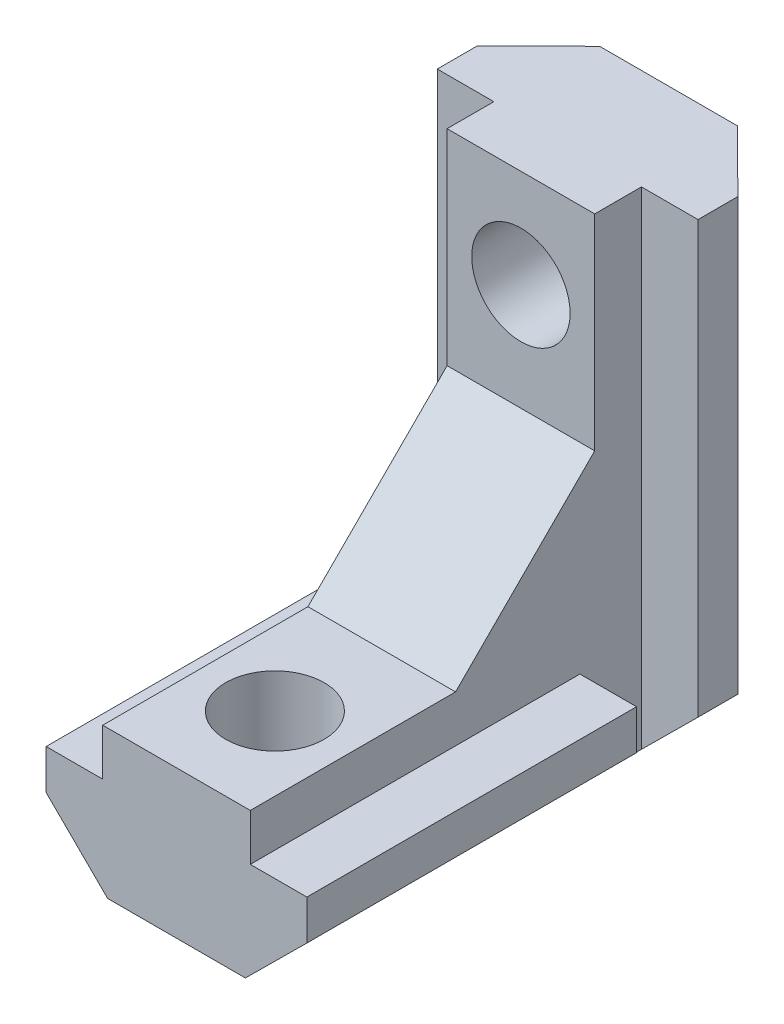
ISO-10303-21;
HEADER;
FILE_DESCRIPTION(('STEP AP214'),'2;1');
FILE_NAME('part.step','',(''),(''),'','','');
FILE_SCHEMA(('AUTOMOTIVE_DESIGN { 1 0 10303 214 1 1 1 1 }'));
ENDSEC;
DATA;
#1=APPLICATION_CONTEXT('core data for automotive mechanical design processes');
#2=APPLICATION_PROTOCOL_DEFINITION('international standard','automotive_design',2000,#1);
#3=PRODUCT_CONTEXT('',#1,'mechanical');
#4=PRODUCT('Part','Part','',(#3));
#5=PRODUCT_RELATED_PRODUCT_CATEGORY('part','',(#4));
#6=PRODUCT_DEFINITION_FORMATION('','',#4);
#7=PRODUCT_DEFINITION_CONTEXT('part definition',#1,'design');
#8=PRODUCT_DEFINITION('design','',#6,#7);
#9=PRODUCT_DEFINITION_SHAPE('','',#8);
#10=(LENGTH_UNIT() NAMED_UNIT(*) SI_UNIT(.MILLI.,.METRE.));
#11=(NAMED_UNIT(*) PLANE_ANGLE_UNIT() SI_UNIT($,.RADIAN.));
#12=(NAMED_UNIT(*) SI_UNIT($,.STERADIAN.) SOLID_ANGLE_UNIT());
#13=UNCERTAINTY_MEASURE_WITH_UNIT(LENGTH_MEASURE(1.E-05),#10,'distance_accuracy_value','');
#14=(GEOMETRIC_REPRESENTATION_CONTEXT(3) GLOBAL_UNCERTAINTY_ASSIGNED_CONTEXT((#13)) GLOBAL_UNIT_ASSIGNED_CONTEXT((#10,
#11,#12)) REPRESENTATION_CONTEXT('',''));
#15=CARTESIAN_POINT('',(0.,0.,0.));
#16=DIRECTION('',(0.,0.,1.));
#17=DIRECTION('',(1.,0.,0.));
#18=AXIS2_PLACEMENT_3D('',#15,#16,#17);
#19=CARTESIAN_POINT('',(-5.3,4.1,20.));
#20=DIRECTION('',(1.,0.,0.));
#21=DIRECTION('',(0.,0.,-1.));
#22=AXIS2_PLACEMENT_3D('',#19,#20,#21);
#23=PLANE('',#22);
#24=DIRECTION('',(0.,-1.,0.));
#25=VECTOR('',#24,1.);
#26=CARTESIAN_POINT('',(-5.3,20.,6.6));
#27=LINE('',#26,#25);
#28=CARTESIAN_POINT('',(-5.3,4.1,6.6));
#29=VERTEX_POINT('',#28);
#30=CARTESIAN_POINT('',(-5.3,2.48,6.6));
#31=VERTEX_POINT('',#30);
#32=EDGE_CURVE('E411',#29,#31,#27,.T.);
#33=ORIENTED_EDGE('',*,*,#32,.T.);
#34=DIRECTION('',(0.,0.,-1.));
#35=VECTOR('',#34,1.);
#36=CARTESIAN_POINT('',(-5.3,2.48,20.));
#37=LINE('',#36,#35);
#38=CARTESIAN_POINT('',(-5.3,2.48,20.));
#39=VERTEX_POINT('',#38);
#40=EDGE_CURVE('E234',#39,#31,#37,.T.);
#41=ORIENTED_EDGE('',*,*,#40,.F.);
#42=DIRECTION('',(0.,-1.,0.));
#43=VECTOR('',#42,1.);
#44=CARTESIAN_POINT('',(-5.3,4.1,20.));
#45=LINE('',#44,#43);
#46=CARTESIAN_POINT('',(-5.3,4.1,20.));
#47=VERTEX_POINT('',#46);
#48=EDGE_CURVE('E319',#47,#39,#45,.T.);
#49=ORIENTED_EDGE('',*,*,#48,.F.);
#50=DIRECTION('',(0.,0.,-1.));
#51=VECTOR('',#50,1.);
#52=CARTESIAN_POINT('',(-5.3,4.1,20.));
#53=LINE('',#52,#51);
#54=EDGE_CURVE('E238',#47,#29,#53,.T.);
#55=ORIENTED_EDGE('',*,*,#54,.T.);
#56=EDGE_LOOP('',(#33,#41,#49,#55));
#57=FACE_BOUND('',#56,.T.);
#58=ADVANCED_FACE('F43',(#57),#23,.F.);
#59=CARTESIAN_POINT('',(-5.3,2.48,4.1));
#60=VERTEX_POINT('',#59);
#61=CARTESIAN_POINT('',(-5.3,2.48,2.48));
#62=VERTEX_POINT('',#61);
#63=EDGE_CURVE('E233',#60,#62,#37,.T.);
#64=ORIENTED_EDGE('',*,*,#63,.F.);
#65=DIRECTION('',(0.,-1.,0.));
#66=VECTOR('',#65,1.);
#67=CARTESIAN_POINT('',(-5.3,20.,4.1));
#68=LINE('',#67,#66);
#69=CARTESIAN_POINT('',(-5.3,20.,4.1));
#70=VERTEX_POINT('',#69);
#71=EDGE_CURVE('E60',#70,#60,#68,.T.);
#72=ORIENTED_EDGE('',*,*,#71,.F.);
#73=DIRECTION('',(0.,0.,1.));
#74=VECTOR('',#73,1.);
#75=CARTESIAN_POINT('',(-5.3,20.,4.1));
#76=LINE('',#75,#74);
#77=CARTESIAN_POINT('',(-5.3,20.,2.48));
#78=VERTEX_POINT('',#77);
#79=EDGE_CURVE('E355',#78,#70,#76,.T.);
#80=ORIENTED_EDGE('',*,*,#79,.F.);
#81=DIRECTION('',(0.,-1.,0.));
#82=VECTOR('',#81,1.);
#83=CARTESIAN_POINT('',(-5.3,20.,2.48));
#84=LINE('',#83,#82);
#85=EDGE_CURVE('E270',#78,#62,#84,.T.);
#86=ORIENTED_EDGE('',*,*,#85,.T.);
#87=EDGE_LOOP('',(#64,#72,#80,#86));
#88=FACE_BOUND('',#87,.T.);
#89=ADVANCED_FACE('F450',(#88),#23,.F.);
#90=CARTESIAN_POINT('',(5.3,4.1,20.));
#91=DIRECTION('',(-1.,0.,0.));
#92=DIRECTION('',(0.,0.,1.));
#93=AXIS2_PLACEMENT_3D('',#90,#91,#92);
#94=PLANE('',#93);
#95=DIRECTION('',(0.,-1.,0.));
#96=VECTOR('',#95,1.);
#97=CARTESIAN_POINT('',(5.3,20.,6.6));
#98=LINE('',#97,#96);
#99=CARTESIAN_POINT('',(5.3,4.1,6.6));
#100=VERTEX_POINT('',#99);
#101=CARTESIAN_POINT('',(5.3,2.48,6.6));
#102=VERTEX_POINT('',#101);
#103=EDGE_CURVE('E195',#100,#102,#98,.T.);
#104=ORIENTED_EDGE('',*,*,#103,.F.);
#105=DIRECTION('',(0.,0.,-1.));
#106=VECTOR('',#105,1.);
#107=CARTESIAN_POINT('',(5.3,4.1,20.));
#108=LINE('',#107,#106);
#109=CARTESIAN_POINT('',(5.3,4.1,20.));
#110=VERTEX_POINT('',#109);
#111=EDGE_CURVE('E206',#110,#100,#108,.T.);
#112=ORIENTED_EDGE('',*,*,#111,.F.);
#113=DIRECTION('',(0.,1.,0.));
#114=VECTOR('',#113,1.);
#115=CARTESIAN_POINT('',(5.3,4.1,20.));
#116=LINE('',#115,#114);
#117=CARTESIAN_POINT('',(5.3,2.48,20.));
#118=VERTEX_POINT('',#117);
#119=EDGE_CURVE('E305',#118,#110,#116,.T.);
#120=ORIENTED_EDGE('',*,*,#119,.F.);
#121=DIRECTION('',(0.,0.,-1.));
#122=VECTOR('',#121,1.);
#123=CARTESIAN_POINT('',(5.3,2.48,20.));
#124=LINE('',#123,#122);
#125=EDGE_CURVE('E223',#118,#102,#124,.T.);
#126=ORIENTED_EDGE('',*,*,#125,.T.);
#127=EDGE_LOOP('',(#104,#112,#120,#126));
#128=FACE_BOUND('',#127,.T.);
#129=ADVANCED_FACE('F456',(#128),#94,.F.);
#130=DIRECTION('',(0.,-1.,0.));
#131=VECTOR('',#130,1.);
#132=CARTESIAN_POINT('',(5.3,20.,4.1));
#133=LINE('',#132,#131);
#134=CARTESIAN_POINT('',(5.3,20.,4.1));
#135=VERTEX_POINT('',#134);
#136=CARTESIAN_POINT('',(5.3,2.48,4.1));
#137=VERTEX_POINT('',#136);
#138=EDGE_CURVE('E288',#135,#137,#133,.T.);
#139=ORIENTED_EDGE('',*,*,#138,.T.);
#140=CARTESIAN_POINT('',(5.3,2.48,2.48));
#141=VERTEX_POINT('',#140);
#142=EDGE_CURVE('E217',#137,#141,#124,.T.);
#143=ORIENTED_EDGE('',*,*,#142,.T.);
#144=DIRECTION('',(0.,-1.,0.));
#145=VECTOR('',#144,1.);
#146=CARTESIAN_POINT('',(5.3,20.,2.48));
#147=LINE('',#146,#145);
#148=CARTESIAN_POINT('',(5.3,20.,2.48));
#149=VERTEX_POINT('',#148);
#150=EDGE_CURVE('E326',#149,#141,#147,.T.);
#151=ORIENTED_EDGE('',*,*,#150,.F.);
#152=DIRECTION('',(0.,0.,-1.));
#153=VECTOR('',#152,1.);
#154=CARTESIAN_POINT('',(5.3,20.,4.1));
#155=LINE('',#154,#153);
#156=EDGE_CURVE('E366',#135,#149,#155,.T.);
#157=ORIENTED_EDGE('',*,*,#156,.F.);
#158=EDGE_LOOP('',(#139,#143,#151,#157));
#159=FACE_BOUND('',#158,.T.);
#160=ADVANCED_FACE('F462',(#159),#94,.F.);
#161=CARTESIAN_POINT('',(-3.,4.1,20.));
#162=DIRECTION('',(0.,-1.,0.));
#163=DIRECTION('',(0.,0.,-1.));
#164=AXIS2_PLACEMENT_3D('',#161,#162,#163);
#165=PLANE('',#164);
#166=DIRECTION('',(1.,0.,0.));
#167=VECTOR('',#166,1.);
#168=CARTESIAN_POINT('',(-3.,4.1,6.6));
#169=LINE('',#168,#167);
#170=CARTESIAN_POINT('',(-3.,4.1,6.6));
#171=VERTEX_POINT('',#170);
#172=EDGE_CURVE('E392',#29,#171,#169,.T.);
#173=ORIENTED_EDGE('',*,*,#172,.F.);
#174=ORIENTED_EDGE('',*,*,#54,.F.);
#175=DIRECTION('',(-1.,0.,0.));
#176=VECTOR('',#175,1.);
#177=CARTESIAN_POINT('',(-3.,4.1,20.));
#178=LINE('',#177,#176);
#179=CARTESIAN_POINT('',(-3.,4.1,20.));
#180=VERTEX_POINT('',#179);
#181=EDGE_CURVE('E286',#180,#47,#178,.T.);
#182=ORIENTED_EDGE('',*,*,#181,.F.);
#183=DIRECTION('',(0.,0.,-1.));
#184=VECTOR('',#183,1.);
#185=CARTESIAN_POINT('',(-3.,4.1,20.));
#186=LINE('',#185,#184);
#187=EDGE_CURVE('E242',#180,#171,#186,.T.);
#188=ORIENTED_EDGE('',*,*,#187,.T.);
#189=EDGE_LOOP('',(#173,#174,#182,#188));
#190=FACE_BOUND('',#189,.T.);
#191=ADVANCED_FACE('F460',(#190),#165,.F.);
#192=CARTESIAN_POINT('',(-2.8,0.,20.));
#193=DIRECTION('',(0.704261315504488,0.709940842242428,0.));
#194=DIRECTION('',(-0.709940842242428,0.704261315504488,0.));
#195=AXIS2_PLACEMENT_3D('',#192,#193,#194);
#196=PLANE('',#195);
#197=DIRECTION('',(-0.709940842242428,0.704261315504488,0.));
#198=VECTOR('',#197,1.);
#199=CARTESIAN_POINT('',(-2.8,0.,6.6));
#200=LINE('',#199,#198);
#201=CARTESIAN_POINT('',(-3.,0.198400000000001,6.6));
#202=VERTEX_POINT('',#201);
#203=EDGE_CURVE('E11',#202,#31,#200,.T.);
#204=ORIENTED_EDGE('',*,*,#203,.F.);
#205=DIRECTION('',(0.,0.,1.));
#206=VECTOR('',#205,1.);
#207=CARTESIAN_POINT('',(-3.,0.1984,20.));
#208=LINE('',#207,#206);
#209=CARTESIAN_POINT('',(-3.,0.198400000000004,4.1));
#210=VERTEX_POINT('',#209);
#211=EDGE_CURVE('E405',#210,#202,#208,.T.);
#212=ORIENTED_EDGE('',*,*,#211,.F.);
#213=DIRECTION('',(0.709940842242428,-0.704261315504488,0.));
#214=VECTOR('',#213,1.);
#215=CARTESIAN_POINT('',(-2.79999999999999,0.,4.1));
#216=LINE('',#215,#214);
#217=EDGE_CURVE('E208',#60,#210,#216,.T.);
#218=ORIENTED_EDGE('',*,*,#217,.F.);
#219=ORIENTED_EDGE('',*,*,#63,.T.);
#220=DIRECTION('',(0.580441809135232,-0.57579827466215,-0.575798274662151));
#221=VECTOR('',#220,1.);
#222=CARTESIAN_POINT('',(-9.48434784483688,6.63087306207818,6.63087306207819));
#223=LINE('',#222,#221);
#224=CARTESIAN_POINT('',(-2.8,0.,0.));
#225=VERTEX_POINT('',#224);
#226=EDGE_CURVE('E53',#62,#225,#223,.T.);
#227=ORIENTED_EDGE('',*,*,#226,.T.);
#228=DIRECTION('',(0.,0.,-1.));
#229=VECTOR('',#228,1.);
#230=CARTESIAN_POINT('',(-2.8,0.,20.));
#231=LINE('',#230,#229);
#232=CARTESIAN_POINT('',(-2.8,0.,20.));
#233=VERTEX_POINT('',#232);
#234=EDGE_CURVE('E230',#233,#225,#231,.T.);
#235=ORIENTED_EDGE('',*,*,#234,.F.);
#236=DIRECTION('',(0.709940842242428,-0.704261315504488,0.));
#237=VECTOR('',#236,1.);
#238=CARTESIAN_POINT('',(-2.8,0.,20.));
#239=LINE('',#238,#237);
#240=EDGE_CURVE('E316',#39,#233,#239,.T.);
#241=ORIENTED_EDGE('',*,*,#240,.F.);
#242=ORIENTED_EDGE('',*,*,#40,.T.);
#243=EDGE_LOOP('',(#204,#212,#218,#219,#227,#235,#241,#242));
#244=FACE_BOUND('',#243,.T.);
#245=ADVANCED_FACE('F253',(#244),#196,.F.);
#246=CARTESIAN_POINT('',(2.8,0.,20.));
#247=DIRECTION('',(-0.704261315504488,0.709940842242428,0.));
#248=DIRECTION('',(-0.709940842242428,-0.704261315504488,0.));
#249=AXIS2_PLACEMENT_3D('',#246,#247,#248);
#250=PLANE('',#249);
#251=DIRECTION('',(-0.709940842242428,-0.704261315504488,0.));
#252=VECTOR('',#251,1.);
#253=CARTESIAN_POINT('',(2.8,0.,6.6));
#254=LINE('',#253,#252);
#255=CARTESIAN_POINT('',(3.,0.198399999999998,6.6));
#256=VERTEX_POINT('',#255);
#257=EDGE_CURVE('E190',#102,#256,#254,.T.);
#258=ORIENTED_EDGE('',*,*,#257,.F.);
#259=ORIENTED_EDGE('',*,*,#125,.F.);
#260=DIRECTION('',(0.709940842242428,0.704261315504488,0.));
#261=VECTOR('',#260,1.);
#262=CARTESIAN_POINT('',(2.8,0.,20.));
#263=LINE('',#262,#261);
#264=CARTESIAN_POINT('',(2.8,0.,20.));
#265=VERTEX_POINT('',#264);
#266=EDGE_CURVE('E310',#265,#118,#263,.T.);
#267=ORIENTED_EDGE('',*,*,#266,.F.);
#268=DIRECTION('',(0.,0.,-1.));
#269=VECTOR('',#268,1.);
#270=CARTESIAN_POINT('',(2.8,0.,20.));
#271=LINE('',#270,#269);
#272=CARTESIAN_POINT('',(2.8,0.,0.));
#273=VERTEX_POINT('',#272);
#274=EDGE_CURVE('E227',#265,#273,#271,.T.);
#275=ORIENTED_EDGE('',*,*,#274,.T.);
#276=DIRECTION('',(0.580441809135232,0.57579827466215,0.575798274662151));
#277=VECTOR('',#276,1.);
#278=CARTESIAN_POINT('',(9.48434784483688,6.63087306207818,6.63087306207819));
#279=LINE('',#278,#277);
#280=EDGE_CURVE('E377',#273,#141,#279,.T.);
#281=ORIENTED_EDGE('',*,*,#280,.T.);
#282=ORIENTED_EDGE('',*,*,#142,.F.);
#283=DIRECTION('',(0.709940842242428,0.704261315504488,0.));
#284=VECTOR('',#283,1.);
#285=CARTESIAN_POINT('',(2.8,0.,4.1));
#286=LINE('',#285,#284);
#287=CARTESIAN_POINT('',(3.,0.198399999999998,4.1));
#288=VERTEX_POINT('',#287);
#289=EDGE_CURVE('E401',#288,#137,#286,.T.);
#290=ORIENTED_EDGE('',*,*,#289,.F.);
#291=DIRECTION('',(0.,0.,-1.));
#292=VECTOR('',#291,1.);
#293=CARTESIAN_POINT('',(3.,0.198399999999998,20.));
#294=LINE('',#293,#292);
#295=EDGE_CURVE('E408',#256,#288,#294,.T.);
#296=ORIENTED_EDGE('',*,*,#295,.F.);
#297=EDGE_LOOP('',(#258,#259,#267,#275,#281,#282,#290,#296));
#298=FACE_BOUND('',#297,.T.);
#299=ADVANCED_FACE('F468',(#298),#250,.F.);
#300=CARTESIAN_POINT('',(3.,4.1,20.));
#301=DIRECTION('',(0.,-1.,0.));
#302=DIRECTION('',(0.,0.,-1.));
#303=AXIS2_PLACEMENT_3D('',#300,#301,#302);
#304=PLANE('',#303);
#305=DIRECTION('',(1.,0.,0.));
#306=VECTOR('',#305,1.);
#307=CARTESIAN_POINT('',(3.,4.1,6.6));
#308=LINE('',#307,#306);
#309=CARTESIAN_POINT('',(3.,4.1,6.6));
#310=VERTEX_POINT('',#309);
#311=EDGE_CURVE('E187',#310,#100,#308,.T.);
#312=ORIENTED_EDGE('',*,*,#311,.F.);
#313=DIRECTION('',(0.,0.,-1.));
#314=VECTOR('',#313,1.);
#315=CARTESIAN_POINT('',(3.,4.1,20.));
#316=LINE('',#315,#314);
#317=CARTESIAN_POINT('',(3.,4.1,20.));
#318=VERTEX_POINT('',#317);
#319=EDGE_CURVE('E203',#318,#310,#316,.T.);
#320=ORIENTED_EDGE('',*,*,#319,.F.);
#321=DIRECTION('',(-1.,0.,0.));
#322=VECTOR('',#321,1.);
#323=CARTESIAN_POINT('',(3.,4.1,20.));
#324=LINE('',#323,#322);
#325=EDGE_CURVE('E303',#110,#318,#324,.T.);
#326=ORIENTED_EDGE('',*,*,#325,.F.);
#327=ORIENTED_EDGE('',*,*,#111,.T.);
#328=EDGE_LOOP('',(#312,#320,#326,#327));
#329=FACE_BOUND('',#328,.T.);
#330=ADVANCED_FACE('F201',(#329),#304,.F.);
#331=CARTESIAN_POINT('',(-3.,6.,20.));
#332=DIRECTION('',(0.,-1.,0.));
#333=DIRECTION('',(0.,0.,-1.));
#334=AXIS2_PLACEMENT_3D('',#331,#332,#333);
#335=PLANE('',#334);
#336=CARTESIAN_POINT('',(0.,6.,16.));
#337=DIRECTION('',(0.,1.,0.));
#338=DIRECTION('',(0.,0.,1.));
#339=AXIS2_PLACEMENT_3D('',#336,#337,#338);
#340=CIRCLE('',#339,2.);
#341=CARTESIAN_POINT('',(0.,6.,18.));
#342=VERTEX_POINT('',#341);
#343=EDGE_CURVE('E428',#342,#342,#340,.T.);
#344=ORIENTED_EDGE('',*,*,#343,.F.);
#345=EDGE_LOOP('',(#344));
#346=FACE_BOUND('',#345,.T.);
#347=DIRECTION('',(-1.,0.,0.));
#348=VECTOR('',#347,1.);
#349=CARTESIAN_POINT('',(3.,6.,11.6568542494924));
#350=LINE('',#349,#348);
#351=CARTESIAN_POINT('',(3.,6.,11.6568542494924));
#352=VERTEX_POINT('',#351);
#353=CARTESIAN_POINT('',(-3.,6.,11.6568542494924));
#354=VERTEX_POINT('',#353);
#355=EDGE_CURVE('E385',#352,#354,#350,.T.);
#356=ORIENTED_EDGE('',*,*,#355,.T.);
#357=DIRECTION('',(0.,0.,-1.));
#358=VECTOR('',#357,1.);
#359=CARTESIAN_POINT('',(-3.,6.,20.));
#360=LINE('',#359,#358);
#361=CARTESIAN_POINT('',(-3.,6.,20.));
#362=VERTEX_POINT('',#361);
#363=EDGE_CURVE('E219',#362,#354,#360,.T.);
#364=ORIENTED_EDGE('',*,*,#363,.F.);
#365=DIRECTION('',(-1.,0.,0.));
#366=VECTOR('',#365,1.);
#367=CARTESIAN_POINT('',(-3.,6.,20.));
#368=LINE('',#367,#366);
#369=CARTESIAN_POINT('',(3.,6.,20.));
#370=VERTEX_POINT('',#369);
#371=EDGE_CURVE('E291',#370,#362,#368,.T.);
#372=ORIENTED_EDGE('',*,*,#371,.F.);
#373=DIRECTION('',(0.,0.,-1.));
#374=VECTOR('',#373,1.);
#375=CARTESIAN_POINT('',(3.,6.,20.));
#376=LINE('',#375,#374);
#377=EDGE_CURVE('E213',#370,#352,#376,.T.);
#378=ORIENTED_EDGE('',*,*,#377,.T.);
#379=EDGE_LOOP('',(#356,#364,#372,#378));
#380=FACE_BOUND('',#379,.T.);
#381=ADVANCED_FACE('F507',(#346,#380),#335,.F.);
#382=CARTESIAN_POINT('',(3.,20.,6.));
#383=DIRECTION('',(0.,0.,-1.));
#384=DIRECTION('',(-1.,0.,0.));
#385=AXIS2_PLACEMENT_3D('',#382,#383,#384);
#386=PLANE('',#385);
#387=CARTESIAN_POINT('',(0.,16.,6.));
#388=DIRECTION('',(0.,0.,1.));
#389=DIRECTION('',(1.,0.,0.));
#390=AXIS2_PLACEMENT_3D('',#387,#388,#389);
#391=CIRCLE('',#390,2.);
#392=CARTESIAN_POINT('',(2.,16.,6.));
#393=VERTEX_POINT('',#392);
#394=EDGE_CURVE('E421',#393,#393,#391,.T.);
#395=ORIENTED_EDGE('',*,*,#394,.F.);
#396=EDGE_LOOP('',(#395));
#397=FACE_BOUND('',#396,.T.);
#398=DIRECTION('',(-1.,0.,0.));
#399=VECTOR('',#398,1.);
#400=CARTESIAN_POINT('',(3.,11.6568542494924,6.));
#401=LINE('',#400,#399);
#402=CARTESIAN_POINT('',(3.,11.6568542494924,6.));
#403=VERTEX_POINT('',#402);
#404=CARTESIAN_POINT('',(-3.,11.6568542494924,6.));
#405=VERTEX_POINT('',#404);
#406=EDGE_CURVE('E381',#403,#405,#401,.T.);
#407=ORIENTED_EDGE('',*,*,#406,.F.);
#408=DIRECTION('',(0.,-1.,0.));
#409=VECTOR('',#408,1.);
#410=CARTESIAN_POINT('',(3.,20.,6.));
#411=LINE('',#410,#409);
#412=CARTESIAN_POINT('',(3.,20.,6.));
#413=VERTEX_POINT('',#412);
#414=EDGE_CURVE('E342',#413,#403,#411,.T.);
#415=ORIENTED_EDGE('',*,*,#414,.F.);
#416=DIRECTION('',(1.,0.,0.));
#417=VECTOR('',#416,1.);
#418=CARTESIAN_POINT('',(3.,20.,6.));
#419=LINE('',#418,#417);
#420=CARTESIAN_POINT('',(-3.,20.,6.));
#421=VERTEX_POINT('',#420);
#422=EDGE_CURVE('E345',#421,#413,#419,.T.);
#423=ORIENTED_EDGE('',*,*,#422,.F.);
#424=DIRECTION('',(0.,-1.,0.));
#425=VECTOR('',#424,1.);
#426=CARTESIAN_POINT('',(-3.,20.,6.));
#427=LINE('',#426,#425);
#428=EDGE_CURVE('E339',#421,#405,#427,.T.);
#429=ORIENTED_EDGE('',*,*,#428,.T.);
#430=EDGE_LOOP('',(#407,#415,#423,#429));
#431=FACE_BOUND('',#430,.T.);
#432=ADVANCED_FACE('F509',(#397,#431),#386,.F.);
#433=CARTESIAN_POINT('',(-2.8,0.,20.));
#434=DIRECTION('',(0.,1.,0.));
#435=DIRECTION('',(0.,0.,1.));
#436=AXIS2_PLACEMENT_3D('',#433,#434,#435);
#437=PLANE('',#436);
#438=CARTESIAN_POINT('',(0.,0.,16.));
#439=DIRECTION('',(0.,1.,0.));
#440=DIRECTION('',(0.,0.,1.));
#441=AXIS2_PLACEMENT_3D('',#438,#439,#440);
#442=CIRCLE('',#441,2.);
#443=CARTESIAN_POINT('',(0.,0.,18.));
#444=VERTEX_POINT('',#443);
#445=EDGE_CURVE('E47',#444,#444,#442,.T.);
#446=ORIENTED_EDGE('',*,*,#445,.T.);
#447=EDGE_LOOP('',(#446));
#448=FACE_BOUND('',#447,.T.);
#449=DIRECTION('',(1.,0.,0.));
#450=VECTOR('',#449,1.);
#451=CARTESIAN_POINT('',(-2.8,0.,0.));
#452=LINE('',#451,#450);
#453=EDGE_CURVE('E274',#225,#273,#452,.T.);
#454=ORIENTED_EDGE('',*,*,#453,.T.);
#455=ORIENTED_EDGE('',*,*,#274,.F.);
#456=DIRECTION('',(1.,0.,0.));
#457=VECTOR('',#456,1.);
#458=CARTESIAN_POINT('',(-2.8,0.,20.));
#459=LINE('',#458,#457);
#460=EDGE_CURVE('E313',#233,#265,#459,.T.);
#461=ORIENTED_EDGE('',*,*,#460,.F.);
#462=ORIENTED_EDGE('',*,*,#234,.T.);
#463=EDGE_LOOP('',(#454,#455,#461,#462));
#464=FACE_BOUND('',#463,.T.);
#465=ADVANCED_FACE('F437',(#448,#464),#437,.F.);
#466=CARTESIAN_POINT('',(2.8,20.,0.));
#467=DIRECTION('',(-0.704261315504489,0.,0.709940842242427));
#468=DIRECTION('',(0.709940842242427,0.,0.704261315504489));
#469=AXIS2_PLACEMENT_3D('',#466,#467,#468);
#470=PLANE('',#469);
#471=ORIENTED_EDGE('',*,*,#280,.F.);
#472=DIRECTION('',(0.,-1.,0.));
#473=VECTOR('',#472,1.);
#474=CARTESIAN_POINT('',(2.8,20.,0.));
#475=LINE('',#474,#473);
#476=CARTESIAN_POINT('',(2.8,20.,0.));
#477=VERTEX_POINT('',#476);
#478=EDGE_CURVE('E269',#477,#273,#475,.T.);
#479=ORIENTED_EDGE('',*,*,#478,.F.);
#480=DIRECTION('',(-0.709940842242427,0.,-0.704261315504489));
#481=VECTOR('',#480,1.);
#482=CARTESIAN_POINT('',(2.8,20.,0.));
#483=LINE('',#482,#481);
#484=EDGE_CURVE('E363',#149,#477,#483,.T.);
#485=ORIENTED_EDGE('',*,*,#484,.F.);
#486=ORIENTED_EDGE('',*,*,#150,.T.);
#487=EDGE_LOOP('',(#471,#479,#485,#486));
#488=FACE_BOUND('',#487,.T.);
#489=ADVANCED_FACE('F492',(#488),#470,.F.);
#490=CARTESIAN_POINT('',(-2.8,20.,0.));
#491=DIRECTION('',(0.704261315504489,0.,0.709940842242427));
#492=DIRECTION('',(0.709940842242427,0.,-0.704261315504489));
#493=AXIS2_PLACEMENT_3D('',#490,#491,#492);
#494=PLANE('',#493);
#495=ORIENTED_EDGE('',*,*,#226,.F.);
#496=ORIENTED_EDGE('',*,*,#85,.F.);
#497=DIRECTION('',(-0.709940842242427,0.,0.704261315504489));
#498=VECTOR('',#497,1.);
#499=CARTESIAN_POINT('',(-2.8,20.,0.));
#500=LINE('',#499,#498);
#501=CARTESIAN_POINT('',(-2.8,20.,0.));
#502=VERTEX_POINT('',#501);
#503=EDGE_CURVE('E265',#502,#78,#500,.T.);
#504=ORIENTED_EDGE('',*,*,#503,.F.);
#505=DIRECTION('',(0.,-1.,0.));
#506=VECTOR('',#505,1.);
#507=CARTESIAN_POINT('',(-2.8,20.,0.));
#508=LINE('',#507,#506);
#509=EDGE_CURVE('E262',#502,#225,#508,.T.);
#510=ORIENTED_EDGE('',*,*,#509,.T.);
#511=EDGE_LOOP('',(#495,#496,#504,#510));
#512=FACE_BOUND('',#511,.T.);
#513=ADVANCED_FACE('F264',(#512),#494,.F.);
#514=CARTESIAN_POINT('',(-3.,6.,20.));
#515=DIRECTION('',(1.,0.,0.));
#516=DIRECTION('',(0.,0.,-1.));
#517=AXIS2_PLACEMENT_3D('',#514,#515,#516);
#518=PLANE('',#517);
#519=DIRECTION('',(0.,-1.,0.));
#520=VECTOR('',#519,1.);
#521=CARTESIAN_POINT('',(-3.,20.,4.1));
#522=LINE('',#521,#520);
#523=CARTESIAN_POINT('',(-3.,20.,4.1));
#524=VERTEX_POINT('',#523);
#525=EDGE_CURVE('E336',#524,#210,#522,.T.);
#526=ORIENTED_EDGE('',*,*,#525,.T.);
#527=ORIENTED_EDGE('',*,*,#211,.T.);
#528=DIRECTION('',(0.,-1.,0.));
#529=VECTOR('',#528,1.);
#530=CARTESIAN_POINT('',(-3.,20.,6.6));
#531=LINE('',#530,#529);
#532=EDGE_CURVE('E413',#171,#202,#531,.T.);
#533=ORIENTED_EDGE('',*,*,#532,.F.);
#534=ORIENTED_EDGE('',*,*,#187,.F.);
#535=DIRECTION('',(0.,-1.,0.));
#536=VECTOR('',#535,1.);
#537=CARTESIAN_POINT('',(-3.,6.,20.));
#538=LINE('',#537,#536);
#539=EDGE_CURVE('E280',#362,#180,#538,.T.);
#540=ORIENTED_EDGE('',*,*,#539,.F.);
#541=ORIENTED_EDGE('',*,*,#363,.T.);
#542=DIRECTION('',(0.,-0.707106781186546,0.707106781186549));
#543=VECTOR('',#542,1.);
#544=CARTESIAN_POINT('',(-3.,11.6568542494924,6.));
#545=LINE('',#544,#543);
#546=EDGE_CURVE('E389',#405,#354,#545,.T.);
#547=ORIENTED_EDGE('',*,*,#546,.F.);
#548=ORIENTED_EDGE('',*,*,#428,.F.);
#549=DIRECTION('',(0.,0.,1.));
#550=VECTOR('',#549,1.);
#551=CARTESIAN_POINT('',(-3.,20.,6.));
#552=LINE('',#551,#550);
#553=EDGE_CURVE('E348',#524,#421,#552,.T.);
#554=ORIENTED_EDGE('',*,*,#553,.F.);
#555=EDGE_LOOP('',(#526,#527,#533,#534,#540,#541,#547,#548,#554));
#556=FACE_BOUND('',#555,.T.);
#557=ADVANCED_FACE('F45',(#556),#518,.F.);
#558=CARTESIAN_POINT('',(3.,6.,20.));
#559=DIRECTION('',(-1.,0.,0.));
#560=DIRECTION('',(0.,0.,1.));
#561=AXIS2_PLACEMENT_3D('',#558,#559,#560);
#562=PLANE('',#561);
#563=DIRECTION('',(0.,-0.707106781186546,0.707106781186549));
#564=VECTOR('',#563,1.);
#565=CARTESIAN_POINT('',(3.,11.6568542494924,6.));
#566=LINE('',#565,#564);
#567=EDGE_CURVE('E68',#403,#352,#566,.T.);
#568=ORIENTED_EDGE('',*,*,#567,.T.);
#569=ORIENTED_EDGE('',*,*,#377,.F.);
#570=DIRECTION('',(0.,1.,0.));
#571=VECTOR('',#570,1.);
#572=CARTESIAN_POINT('',(3.,6.,20.));
#573=LINE('',#572,#571);
#574=EDGE_CURVE('E211',#318,#370,#573,.T.);
#575=ORIENTED_EDGE('',*,*,#574,.F.);
#576=ORIENTED_EDGE('',*,*,#319,.T.);
#577=DIRECTION('',(0.,-1.,0.));
#578=VECTOR('',#577,1.);
#579=CARTESIAN_POINT('',(3.,20.,6.6));
#580=LINE('',#579,#578);
#581=EDGE_CURVE('E184',#310,#256,#580,.T.);
#582=ORIENTED_EDGE('',*,*,#581,.T.);
#583=ORIENTED_EDGE('',*,*,#295,.T.);
#584=DIRECTION('',(0.,-1.,0.));
#585=VECTOR('',#584,1.);
#586=CARTESIAN_POINT('',(3.,20.,4.1));
#587=LINE('',#586,#585);
#588=CARTESIAN_POINT('',(3.,20.,4.1));
#589=VERTEX_POINT('',#588);
#590=EDGE_CURVE('E281',#589,#288,#587,.T.);
#591=ORIENTED_EDGE('',*,*,#590,.F.);
#592=DIRECTION('',(0.,0.,-1.));
#593=VECTOR('',#592,1.);
#594=CARTESIAN_POINT('',(3.,20.,6.));
#595=LINE('',#594,#593);
#596=EDGE_CURVE('E373',#413,#589,#595,.T.);
#597=ORIENTED_EDGE('',*,*,#596,.F.);
#598=ORIENTED_EDGE('',*,*,#414,.T.);
#599=EDGE_LOOP('',(#568,#569,#575,#576,#582,#583,#591,#597,#598));
#600=FACE_BOUND('',#599,.T.);
#601=ADVANCED_FACE('F210',(#600),#562,.F.);
#602=CARTESIAN_POINT('',(0.,0.,20.));
#603=DIRECTION('',(0.,0.,-1.));
#604=DIRECTION('',(-1.,0.,0.));
#605=AXIS2_PLACEMENT_3D('',#602,#603,#604);
#606=PLANE('',#605);
#607=ORIENTED_EDGE('',*,*,#539,.T.);
#608=ORIENTED_EDGE('',*,*,#181,.T.);
#609=ORIENTED_EDGE('',*,*,#48,.T.);
#610=ORIENTED_EDGE('',*,*,#240,.T.);
#611=ORIENTED_EDGE('',*,*,#460,.T.);
#612=ORIENTED_EDGE('',*,*,#266,.T.);
#613=ORIENTED_EDGE('',*,*,#119,.T.);
#614=ORIENTED_EDGE('',*,*,#325,.T.);
#615=ORIENTED_EDGE('',*,*,#574,.T.);
#616=ORIENTED_EDGE('',*,*,#371,.T.);
#617=EDGE_LOOP('',(#607,#608,#609,#610,#611,#612,#613,#614,#615,#616));
#618=FACE_BOUND('',#617,.T.);
#619=ADVANCED_FACE('F478',(#618),#606,.F.);
#620=CARTESIAN_POINT('',(0.,0.,0.));
#621=DIRECTION('',(0.,0.,-1.));
#622=DIRECTION('',(-1.,0.,0.));
#623=AXIS2_PLACEMENT_3D('',#620,#621,#622);
#624=PLANE('',#623);
#625=CARTESIAN_POINT('',(0.,16.,0.));
#626=DIRECTION('',(0.,0.,1.));
#627=DIRECTION('',(1.,0.,0.));
#628=AXIS2_PLACEMENT_3D('',#625,#626,#627);
#629=CIRCLE('',#628,2.);
#630=CARTESIAN_POINT('',(2.,16.,0.));
#631=VERTEX_POINT('',#630);
#632=EDGE_CURVE('E196',#631,#631,#629,.T.);
#633=ORIENTED_EDGE('',*,*,#632,.T.);
#634=EDGE_LOOP('',(#633));
#635=FACE_BOUND('',#634,.T.);
#636=ORIENTED_EDGE('',*,*,#453,.F.);
#637=ORIENTED_EDGE('',*,*,#509,.F.);
#638=DIRECTION('',(-1.,0.,0.));
#639=VECTOR('',#638,1.);
#640=CARTESIAN_POINT('',(2.8,20.,0.));
#641=LINE('',#640,#639);
#642=EDGE_CURVE('E360',#477,#502,#641,.T.);
#643=ORIENTED_EDGE('',*,*,#642,.F.);
#644=ORIENTED_EDGE('',*,*,#478,.T.);
#645=EDGE_LOOP('',(#636,#637,#643,#644));
#646=FACE_BOUND('',#645,.T.);
#647=ADVANCED_FACE('F275',(#635,#646),#624,.T.);
#648=CARTESIAN_POINT('',(0.,20.,0.));
#649=DIRECTION('',(0.,-1.,0.));
#650=DIRECTION('',(0.,0.,-1.));
#651=AXIS2_PLACEMENT_3D('',#648,#649,#650);
#652=PLANE('',#651);
#653=ORIENTED_EDGE('',*,*,#596,.T.);
#654=DIRECTION('',(1.,0.,0.));
#655=VECTOR('',#654,1.);
#656=CARTESIAN_POINT('',(3.,20.,4.1));
#657=LINE('',#656,#655);
#658=EDGE_CURVE('E370',#589,#135,#657,.T.);
#659=ORIENTED_EDGE('',*,*,#658,.T.);
#660=ORIENTED_EDGE('',*,*,#156,.T.);
#661=ORIENTED_EDGE('',*,*,#484,.T.);
#662=ORIENTED_EDGE('',*,*,#642,.T.);
#663=ORIENTED_EDGE('',*,*,#503,.T.);
#664=ORIENTED_EDGE('',*,*,#79,.T.);
#665=DIRECTION('',(1.,0.,0.));
#666=VECTOR('',#665,1.);
#667=CARTESIAN_POINT('',(-3.,20.,4.1));
#668=LINE('',#667,#666);
#669=EDGE_CURVE('E351',#70,#524,#668,.T.);
#670=ORIENTED_EDGE('',*,*,#669,.T.);
#671=ORIENTED_EDGE('',*,*,#553,.T.);
#672=ORIENTED_EDGE('',*,*,#422,.T.);
#673=EDGE_LOOP('',(#653,#659,#660,#661,#662,#663,#664,#670,#671,#672));
#674=FACE_BOUND('',#673,.T.);
#675=ADVANCED_FACE('F494',(#674),#652,.F.);
#676=CARTESIAN_POINT('',(3.,20.,4.1));
#677=DIRECTION('',(0.,0.,-1.));
#678=DIRECTION('',(-1.,0.,0.));
#679=AXIS2_PLACEMENT_3D('',#676,#677,#678);
#680=PLANE('',#679);
#681=ORIENTED_EDGE('',*,*,#590,.T.);
#682=ORIENTED_EDGE('',*,*,#289,.T.);
#683=ORIENTED_EDGE('',*,*,#138,.F.);
#684=ORIENTED_EDGE('',*,*,#658,.F.);
#685=EDGE_LOOP('',(#681,#682,#683,#684));
#686=FACE_BOUND('',#685,.T.);
#687=ADVANCED_FACE('F498',(#686),#680,.F.);
#688=CARTESIAN_POINT('',(-3.,20.,4.1));
#689=DIRECTION('',(0.,0.,-1.));
#690=DIRECTION('',(-1.,0.,0.));
#691=AXIS2_PLACEMENT_3D('',#688,#689,#690);
#692=PLANE('',#691);
#693=ORIENTED_EDGE('',*,*,#71,.T.);
#694=ORIENTED_EDGE('',*,*,#217,.T.);
#695=ORIENTED_EDGE('',*,*,#525,.F.);
#696=ORIENTED_EDGE('',*,*,#669,.F.);
#697=EDGE_LOOP('',(#693,#694,#695,#696));
#698=FACE_BOUND('',#697,.T.);
#699=ADVANCED_FACE('F539',(#698),#692,.F.);
#700=CARTESIAN_POINT('',(3.,11.6568542494924,6.));
#701=DIRECTION('',(0.,-0.707106781186549,-0.707106781186546));
#702=DIRECTION('',(0.,0.707106781186546,-0.707106781186549));
#703=AXIS2_PLACEMENT_3D('',#700,#701,#702);
#704=PLANE('',#703);
#705=ORIENTED_EDGE('',*,*,#546,.T.);
#706=ORIENTED_EDGE('',*,*,#355,.F.);
#707=ORIENTED_EDGE('',*,*,#567,.F.);
#708=ORIENTED_EDGE('',*,*,#406,.T.);
#709=EDGE_LOOP('',(#705,#706,#707,#708));
#710=FACE_BOUND('',#709,.T.);
#711=ADVANCED_FACE('F505',(#710),#704,.F.);
#712=CARTESIAN_POINT('',(5.3,20.,6.6));
#713=DIRECTION('',(0.,0.,-1.));
#714=DIRECTION('',(-1.,0.,0.));
#715=AXIS2_PLACEMENT_3D('',#712,#713,#714);
#716=PLANE('',#715);
#717=ORIENTED_EDGE('',*,*,#257,.T.);
#718=ORIENTED_EDGE('',*,*,#581,.F.);
#719=ORIENTED_EDGE('',*,*,#311,.T.);
#720=ORIENTED_EDGE('',*,*,#103,.T.);
#721=EDGE_LOOP('',(#717,#718,#719,#720));
#722=FACE_BOUND('',#721,.T.);
#723=ADVANCED_FACE('F186',(#722),#716,.T.);
#724=CARTESIAN_POINT('',(-5.3,20.,6.6));
#725=DIRECTION('',(0.,0.,-1.));
#726=DIRECTION('',(-1.,0.,0.));
#727=AXIS2_PLACEMENT_3D('',#724,#725,#726);
#728=PLANE('',#727);
#729=ORIENTED_EDGE('',*,*,#172,.T.);
#730=ORIENTED_EDGE('',*,*,#532,.T.);
#731=ORIENTED_EDGE('',*,*,#203,.T.);
#732=ORIENTED_EDGE('',*,*,#32,.F.);
#733=EDGE_LOOP('',(#729,#730,#731,#732));
#734=FACE_BOUND('',#733,.T.);
#735=ADVANCED_FACE('F446',(#734),#728,.T.);
#736=CARTESIAN_POINT('',(0.,16.,0.));
#737=DIRECTION('',(0.,0.,1.));
#738=DIRECTION('',(1.,0.,0.));
#739=AXIS2_PLACEMENT_3D('',#736,#737,#738);
#740=CYLINDRICAL_SURFACE('',#739,2.);
#741=ORIENTED_EDGE('',*,*,#632,.F.);
#742=EDGE_LOOP('',(#741));
#743=FACE_BOUND('',#742,.T.);
#744=ORIENTED_EDGE('',*,*,#394,.T.);
#745=EDGE_LOOP('',(#744));
#746=FACE_BOUND('',#745,.T.);
#747=ADVANCED_FACE('F441',(#743,#746),#740,.F.);
#748=CARTESIAN_POINT('',(0.,-4.,16.));
#749=DIRECTION('',(0.,1.,0.));
#750=DIRECTION('',(0.,0.,1.));
#751=AXIS2_PLACEMENT_3D('',#748,#749,#750);
#752=CYLINDRICAL_SURFACE('',#751,2.);
#753=ORIENTED_EDGE('',*,*,#343,.T.);
#754=EDGE_LOOP('',(#753));
#755=FACE_BOUND('',#754,.T.);
#756=ORIENTED_EDGE('',*,*,#445,.F.);
#757=EDGE_LOOP('',(#756));
#758=FACE_BOUND('',#757,.T.);
#759=ADVANCED_FACE('F439',(#755,#758),#752,.F.);
#760=CLOSED_SHELL('',(#58,#89,#129,#160,#191,#245,#299,#330,#381,#432,#465,#489,#513,#557,#601,
#619,#647,#675,#687,#699,#711,#723,#735,#747,#759));
#761=MANIFOLD_SOLID_BREP('B2',#760);
#762=ADVANCED_BREP_SHAPE_REPRESENTATION('',(#18,#761),#14);
#763=SHAPE_DEFINITION_REPRESENTATION(#9,#762);
ENDSEC;
END-ISO-10303-21;
